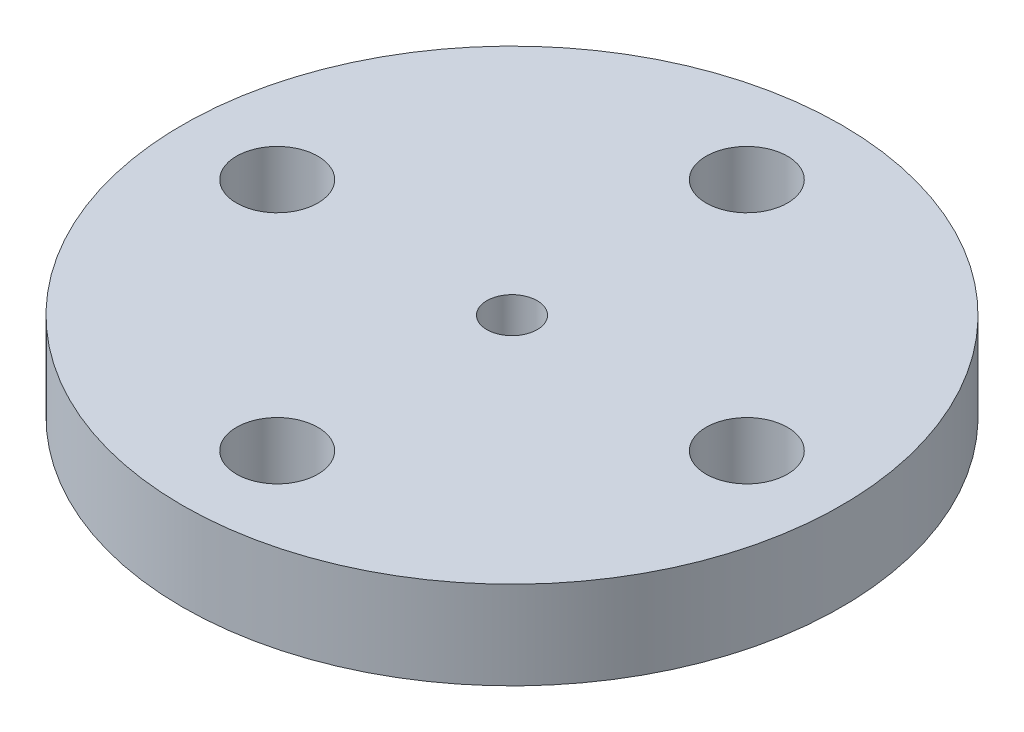
ISO-10303-21;
HEADER;
FILE_DESCRIPTION(('STEP AP214'),'2;1');
FILE_NAME('part.step','',(''),(''),'','','');
FILE_SCHEMA(('AUTOMOTIVE_DESIGN { 1 0 10303 214 1 1 1 1 }'));
ENDSEC;
DATA;
#1=APPLICATION_CONTEXT('core data for automotive mechanical design processes');
#2=APPLICATION_PROTOCOL_DEFINITION('international standard','automotive_design',2000,#1);
#3=PRODUCT_CONTEXT('',#1,'mechanical');
#4=PRODUCT('Part','Part','',(#3));
#5=PRODUCT_RELATED_PRODUCT_CATEGORY('part','',(#4));
#6=PRODUCT_DEFINITION_FORMATION('','',#4);
#7=PRODUCT_DEFINITION_CONTEXT('part definition',#1,'design');
#8=PRODUCT_DEFINITION('design','',#6,#7);
#9=PRODUCT_DEFINITION_SHAPE('','',#8);
#10=(LENGTH_UNIT() NAMED_UNIT(*) SI_UNIT(.MILLI.,.METRE.));
#11=(NAMED_UNIT(*) PLANE_ANGLE_UNIT() SI_UNIT($,.RADIAN.));
#12=(NAMED_UNIT(*) SI_UNIT($,.STERADIAN.) SOLID_ANGLE_UNIT());
#13=UNCERTAINTY_MEASURE_WITH_UNIT(LENGTH_MEASURE(1.E-05),#10,'distance_accuracy_value','');
#14=(GEOMETRIC_REPRESENTATION_CONTEXT(3) GLOBAL_UNCERTAINTY_ASSIGNED_CONTEXT((#13)) GLOBAL_UNIT_ASSIGNED_CONTEXT((#10,
#11,#12)) REPRESENTATION_CONTEXT('',''));
#15=CARTESIAN_POINT('',(0.,0.,0.));
#16=DIRECTION('',(0.,0.,1.));
#17=DIRECTION('',(1.,0.,0.));
#18=AXIS2_PLACEMENT_3D('',#15,#16,#17);
#19=CARTESIAN_POINT('',(0.,2.667,0.));
#20=DIRECTION('',(0.,1.,0.));
#21=DIRECTION('',(0.,0.,1.));
#22=AXIS2_PLACEMENT_3D('',#19,#20,#21);
#23=PLANE('',#22);
#24=CARTESIAN_POINT('',(0.,2.667,7.112));
#25=DIRECTION('',(0.,1.,0.));
#26=DIRECTION('',(0.,0.,1.));
#27=AXIS2_PLACEMENT_3D('',#24,#25,#26);
#28=CIRCLE('',#27,1.2319);
#29=CARTESIAN_POINT('',(0.,2.667,8.3439));
#30=VERTEX_POINT('',#29);
#31=EDGE_CURVE('E58',#30,#30,#28,.T.);
#32=ORIENTED_EDGE('',*,*,#31,.F.);
#33=EDGE_LOOP('',(#32));
#34=FACE_BOUND('',#33,.T.);
#35=CARTESIAN_POINT('',(0.,2.667,-7.112));
#36=DIRECTION('',(0.,1.,0.));
#37=DIRECTION('',(0.,0.,1.));
#38=AXIS2_PLACEMENT_3D('',#35,#36,#37);
#39=CIRCLE('',#38,1.2319);
#40=CARTESIAN_POINT('',(0.,2.667,-5.8801));
#41=VERTEX_POINT('',#40);
#42=EDGE_CURVE('E46',#41,#41,#39,.T.);
#43=ORIENTED_EDGE('',*,*,#42,.F.);
#44=EDGE_LOOP('',(#43));
#45=FACE_BOUND('',#44,.T.);
#46=CARTESIAN_POINT('',(0.,2.667,0.));
#47=DIRECTION('',(0.,1.,0.));
#48=DIRECTION('',(0.,0.,1.));
#49=AXIS2_PLACEMENT_3D('',#46,#47,#48);
#50=CIRCLE('',#49,9.9822);
#51=CARTESIAN_POINT('',(0.,2.667,9.9822));
#52=VERTEX_POINT('',#51);
#53=EDGE_CURVE('E10',#52,#52,#50,.T.);
#54=ORIENTED_EDGE('',*,*,#53,.T.);
#55=EDGE_LOOP('',(#54));
#56=FACE_BOUND('',#55,.T.);
#57=CARTESIAN_POINT('',(-7.112,2.667,0.));
#58=DIRECTION('',(0.,1.,0.));
#59=DIRECTION('',(0.,0.,1.));
#60=AXIS2_PLACEMENT_3D('',#57,#58,#59);
#61=CIRCLE('',#60,1.2319);
#62=CARTESIAN_POINT('',(-7.112,2.667,1.2319));
#63=VERTEX_POINT('',#62);
#64=EDGE_CURVE('E41',#63,#63,#61,.T.);
#65=ORIENTED_EDGE('',*,*,#64,.F.);
#66=EDGE_LOOP('',(#65));
#67=FACE_BOUND('',#66,.T.);
#68=CARTESIAN_POINT('',(7.112,2.667,0.));
#69=DIRECTION('',(0.,1.,0.));
#70=DIRECTION('',(0.,0.,1.));
#71=AXIS2_PLACEMENT_3D('',#68,#69,#70);
#72=CIRCLE('',#71,1.2319);
#73=CARTESIAN_POINT('',(7.112,2.667,1.2319));
#74=VERTEX_POINT('',#73);
#75=EDGE_CURVE('E52',#74,#74,#72,.T.);
#76=ORIENTED_EDGE('',*,*,#75,.F.);
#77=EDGE_LOOP('',(#76));
#78=FACE_BOUND('',#77,.T.);
#79=CARTESIAN_POINT('',(0.,2.667,0.));
#80=DIRECTION('',(0.,1.,0.));
#81=DIRECTION('',(0.,0.,1.));
#82=AXIS2_PLACEMENT_3D('',#79,#80,#81);
#83=CIRCLE('',#82,0.762);
#84=CARTESIAN_POINT('',(0.,2.667,0.762));
#85=VERTEX_POINT('',#84);
#86=EDGE_CURVE('E64',#85,#85,#83,.T.);
#87=ORIENTED_EDGE('',*,*,#86,.F.);
#88=EDGE_LOOP('',(#87));
#89=FACE_BOUND('',#88,.T.);
#90=ADVANCED_FACE('F30',(#34,#45,#56,#67,#78,#89),#23,.T.);
#91=CARTESIAN_POINT('',(0.,0.,0.));
#92=DIRECTION('',(0.,1.,0.));
#93=DIRECTION('',(0.,0.,1.));
#94=AXIS2_PLACEMENT_3D('',#91,#92,#93);
#95=PLANE('',#94);
#96=CARTESIAN_POINT('',(0.,0.,0.));
#97=DIRECTION('',(0.,1.,0.));
#98=DIRECTION('',(0.,0.,1.));
#99=AXIS2_PLACEMENT_3D('',#96,#97,#98);
#100=CIRCLE('',#99,9.9822);
#101=CARTESIAN_POINT('',(0.,0.,9.9822));
#102=VERTEX_POINT('',#101);
#103=EDGE_CURVE('E34',#102,#102,#100,.T.);
#104=ORIENTED_EDGE('',*,*,#103,.F.);
#105=EDGE_LOOP('',(#104));
#106=FACE_BOUND('',#105,.T.);
#107=CARTESIAN_POINT('',(-7.112,0.,0.));
#108=DIRECTION('',(0.,1.,0.));
#109=DIRECTION('',(0.,0.,1.));
#110=AXIS2_PLACEMENT_3D('',#107,#108,#109);
#111=CIRCLE('',#110,1.2319);
#112=CARTESIAN_POINT('',(-7.112,0.,1.2319));
#113=VERTEX_POINT('',#112);
#114=EDGE_CURVE('E43',#113,#113,#111,.T.);
#115=ORIENTED_EDGE('',*,*,#114,.T.);
#116=EDGE_LOOP('',(#115));
#117=FACE_BOUND('',#116,.T.);
#118=CARTESIAN_POINT('',(0.,0.,-7.112));
#119=DIRECTION('',(0.,1.,0.));
#120=DIRECTION('',(0.,0.,1.));
#121=AXIS2_PLACEMENT_3D('',#118,#119,#120);
#122=CIRCLE('',#121,1.2319);
#123=CARTESIAN_POINT('',(0.,0.,-5.8801));
#124=VERTEX_POINT('',#123);
#125=EDGE_CURVE('E49',#124,#124,#122,.T.);
#126=ORIENTED_EDGE('',*,*,#125,.T.);
#127=EDGE_LOOP('',(#126));
#128=FACE_BOUND('',#127,.T.);
#129=CARTESIAN_POINT('',(7.112,0.,0.));
#130=DIRECTION('',(0.,1.,0.));
#131=DIRECTION('',(0.,0.,1.));
#132=AXIS2_PLACEMENT_3D('',#129,#130,#131);
#133=CIRCLE('',#132,1.2319);
#134=CARTESIAN_POINT('',(7.112,0.,1.2319));
#135=VERTEX_POINT('',#134);
#136=EDGE_CURVE('E55',#135,#135,#133,.T.);
#137=ORIENTED_EDGE('',*,*,#136,.T.);
#138=EDGE_LOOP('',(#137));
#139=FACE_BOUND('',#138,.T.);
#140=CARTESIAN_POINT('',(0.,0.,7.112));
#141=DIRECTION('',(0.,1.,0.));
#142=DIRECTION('',(0.,0.,1.));
#143=AXIS2_PLACEMENT_3D('',#140,#141,#142);
#144=CIRCLE('',#143,1.2319);
#145=CARTESIAN_POINT('',(0.,0.,8.3439));
#146=VERTEX_POINT('',#145);
#147=EDGE_CURVE('E61',#146,#146,#144,.T.);
#148=ORIENTED_EDGE('',*,*,#147,.T.);
#149=EDGE_LOOP('',(#148));
#150=FACE_BOUND('',#149,.T.);
#151=CARTESIAN_POINT('',(0.,0.,0.));
#152=DIRECTION('',(0.,1.,0.));
#153=DIRECTION('',(0.,0.,1.));
#154=AXIS2_PLACEMENT_3D('',#151,#152,#153);
#155=CIRCLE('',#154,0.762);
#156=CARTESIAN_POINT('',(0.,0.,0.762));
#157=VERTEX_POINT('',#156);
#158=EDGE_CURVE('E67',#157,#157,#155,.T.);
#159=ORIENTED_EDGE('',*,*,#158,.T.);
#160=EDGE_LOOP('',(#159));
#161=FACE_BOUND('',#160,.T.);
#162=ADVANCED_FACE('F77',(#106,#117,#128,#139,#150,#161),#95,.F.);
#163=CARTESIAN_POINT('',(0.,2.667,0.));
#164=DIRECTION('',(0.,-1.,0.));
#165=DIRECTION('',(0.,0.,-1.));
#166=AXIS2_PLACEMENT_3D('',#163,#164,#165);
#167=CYLINDRICAL_SURFACE('',#166,9.9822);
#168=ORIENTED_EDGE('',*,*,#53,.F.);
#169=EDGE_LOOP('',(#168));
#170=FACE_BOUND('',#169,.T.);
#171=ORIENTED_EDGE('',*,*,#103,.T.);
#172=EDGE_LOOP('',(#171));
#173=FACE_BOUND('',#172,.T.);
#174=ADVANCED_FACE('F32',(#170,#173),#167,.T.);
#175=CARTESIAN_POINT('',(-7.112,2.667,0.));
#176=DIRECTION('',(0.,-1.,0.));
#177=DIRECTION('',(0.,0.,-1.));
#178=AXIS2_PLACEMENT_3D('',#175,#176,#177);
#179=CYLINDRICAL_SURFACE('',#178,1.2319);
#180=ORIENTED_EDGE('',*,*,#64,.T.);
#181=EDGE_LOOP('',(#180));
#182=FACE_BOUND('',#181,.T.);
#183=ORIENTED_EDGE('',*,*,#114,.F.);
#184=EDGE_LOOP('',(#183));
#185=FACE_BOUND('',#184,.T.);
#186=ADVANCED_FACE('F87',(#182,#185),#179,.F.);
#187=CARTESIAN_POINT('',(0.,2.667,-7.112));
#188=DIRECTION('',(0.,-1.,0.));
#189=DIRECTION('',(0.,0.,-1.));
#190=AXIS2_PLACEMENT_3D('',#187,#188,#189);
#191=CYLINDRICAL_SURFACE('',#190,1.2319);
#192=ORIENTED_EDGE('',*,*,#42,.T.);
#193=EDGE_LOOP('',(#192));
#194=FACE_BOUND('',#193,.T.);
#195=ORIENTED_EDGE('',*,*,#125,.F.);
#196=EDGE_LOOP('',(#195));
#197=FACE_BOUND('',#196,.T.);
#198=ADVANCED_FACE('F90',(#194,#197),#191,.F.);
#199=CARTESIAN_POINT('',(7.112,2.667,0.));
#200=DIRECTION('',(0.,-1.,0.));
#201=DIRECTION('',(0.,0.,-1.));
#202=AXIS2_PLACEMENT_3D('',#199,#200,#201);
#203=CYLINDRICAL_SURFACE('',#202,1.2319);
#204=ORIENTED_EDGE('',*,*,#75,.T.);
#205=EDGE_LOOP('',(#204));
#206=FACE_BOUND('',#205,.T.);
#207=ORIENTED_EDGE('',*,*,#136,.F.);
#208=EDGE_LOOP('',(#207));
#209=FACE_BOUND('',#208,.T.);
#210=ADVANCED_FACE('F94',(#206,#209),#203,.F.);
#211=CARTESIAN_POINT('',(0.,2.667,7.112));
#212=DIRECTION('',(0.,-1.,0.));
#213=DIRECTION('',(0.,0.,-1.));
#214=AXIS2_PLACEMENT_3D('',#211,#212,#213);
#215=CYLINDRICAL_SURFACE('',#214,1.2319);
#216=ORIENTED_EDGE('',*,*,#31,.T.);
#217=EDGE_LOOP('',(#216));
#218=FACE_BOUND('',#217,.T.);
#219=ORIENTED_EDGE('',*,*,#147,.F.);
#220=EDGE_LOOP('',(#219));
#221=FACE_BOUND('',#220,.T.);
#222=ADVANCED_FACE('F98',(#218,#221),#215,.F.);
#223=CARTESIAN_POINT('',(0.,2.667,0.));
#224=DIRECTION('',(0.,-1.,0.));
#225=DIRECTION('',(0.,0.,-1.));
#226=AXIS2_PLACEMENT_3D('',#223,#224,#225);
#227=CYLINDRICAL_SURFACE('',#226,0.762);
#228=ORIENTED_EDGE('',*,*,#86,.T.);
#229=EDGE_LOOP('',(#228));
#230=FACE_BOUND('',#229,.T.);
#231=ORIENTED_EDGE('',*,*,#158,.F.);
#232=EDGE_LOOP('',(#231));
#233=FACE_BOUND('',#232,.T.);
#234=ADVANCED_FACE('F73',(#230,#233),#227,.F.);
#235=CLOSED_SHELL('',(#90,#162,#174,#186,#198,#210,#222,#234));
#236=MANIFOLD_SOLID_BREP('B2',#235);
#237=ADVANCED_BREP_SHAPE_REPRESENTATION('',(#18,#236),#14);
#238=SHAPE_DEFINITION_REPRESENTATION(#9,#237);
ENDSEC;
END-ISO-10303-21;
